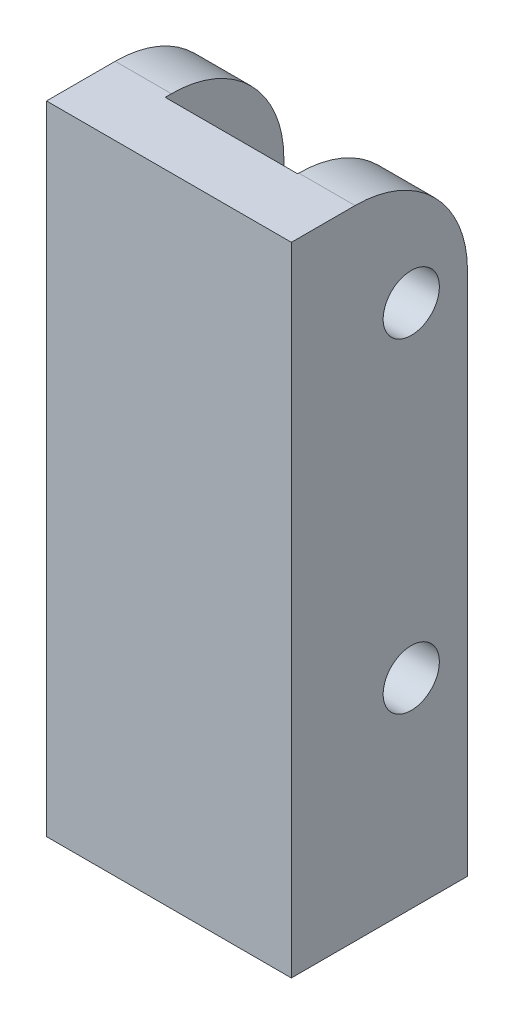
ISO-10303-21;
HEADER;
FILE_DESCRIPTION(('STEP AP214'),'2;1');
FILE_NAME('part.step','',(''),(''),'','','');
FILE_SCHEMA(('AUTOMOTIVE_DESIGN { 1 0 10303 214 1 1 1 1 }'));
ENDSEC;
DATA;
#1=APPLICATION_CONTEXT('core data for automotive mechanical design processes');
#2=APPLICATION_PROTOCOL_DEFINITION('international standard','automotive_design',2000,#1);
#3=PRODUCT_CONTEXT('',#1,'mechanical');
#4=PRODUCT('Part','Part','',(#3));
#5=PRODUCT_RELATED_PRODUCT_CATEGORY('part','',(#4));
#6=PRODUCT_DEFINITION_FORMATION('','',#4);
#7=PRODUCT_DEFINITION_CONTEXT('part definition',#1,'design');
#8=PRODUCT_DEFINITION('design','',#6,#7);
#9=PRODUCT_DEFINITION_SHAPE('','',#8);
#10=(LENGTH_UNIT() NAMED_UNIT(*) SI_UNIT(.MILLI.,.METRE.));
#11=(NAMED_UNIT(*) PLANE_ANGLE_UNIT() SI_UNIT($,.RADIAN.));
#12=(NAMED_UNIT(*) SI_UNIT($,.STERADIAN.) SOLID_ANGLE_UNIT());
#13=UNCERTAINTY_MEASURE_WITH_UNIT(LENGTH_MEASURE(1.E-05),#10,'distance_accuracy_value','');
#14=(GEOMETRIC_REPRESENTATION_CONTEXT(3) GLOBAL_UNCERTAINTY_ASSIGNED_CONTEXT((#13)) GLOBAL_UNIT_ASSIGNED_CONTEXT((#10,
#11,#12)) REPRESENTATION_CONTEXT('',''));
#15=CARTESIAN_POINT('',(0.,0.,0.));
#16=DIRECTION('',(0.,0.,1.));
#17=DIRECTION('',(1.,0.,0.));
#18=AXIS2_PLACEMENT_3D('',#15,#16,#17);
#19=CARTESIAN_POINT('',(0.,51.,0.));
#20=DIRECTION('',(-1.,0.,0.));
#21=DIRECTION('',(0.,0.,1.));
#22=AXIS2_PLACEMENT_3D('',#19,#20,#21);
#23=PLANE('',#22);
#24=CARTESIAN_POINT('',(0.,42.,-4.59779179810726));
#25=DIRECTION('',(-1.,0.,0.));
#26=DIRECTION('',(0.,0.,1.));
#27=AXIS2_PLACEMENT_3D('',#24,#25,#26);
#28=CIRCLE('',#27,2.25);
#29=CARTESIAN_POINT('',(0.,42.,-2.34779179810726));
#30=VERTEX_POINT('',#29);
#31=EDGE_CURVE('E150',#30,#30,#28,.T.);
#32=ORIENTED_EDGE('',*,*,#31,.T.);
#33=EDGE_LOOP('',(#32));
#34=FACE_BOUND('',#33,.T.);
#35=CARTESIAN_POINT('',(0.,16.,-4.59779179810726));
#36=DIRECTION('',(-1.,0.,0.));
#37=DIRECTION('',(0.,0.,1.));
#38=AXIS2_PLACEMENT_3D('',#35,#36,#37);
#39=CIRCLE('',#38,2.25);
#40=CARTESIAN_POINT('',(0.,16.,-2.34779179810726));
#41=VERTEX_POINT('',#40);
#42=EDGE_CURVE('E183',#41,#41,#39,.T.);
#43=ORIENTED_EDGE('',*,*,#42,.T.);
#44=EDGE_LOOP('',(#43));
#45=FACE_BOUND('',#44,.T.);
#46=DIRECTION('',(0.,-1.,0.));
#47=VECTOR('',#46,1.);
#48=CARTESIAN_POINT('',(0.,51.,-9.5));
#49=LINE('',#48,#47);
#50=CARTESIAN_POINT('',(0.,42.,-9.5));
#51=VERTEX_POINT('',#50);
#52=CARTESIAN_POINT('',(0.,0.,-9.5));
#53=VERTEX_POINT('',#52);
#54=EDGE_CURVE('E177',#51,#53,#49,.T.);
#55=ORIENTED_EDGE('',*,*,#54,.F.);
#56=CARTESIAN_POINT('',(0.,42.,-0.5));
#57=DIRECTION('',(-1.,0.,0.));
#58=DIRECTION('',(0.,0.,1.));
#59=AXIS2_PLACEMENT_3D('',#56,#57,#58);
#60=CIRCLE('',#59,9.);
#61=CARTESIAN_POINT('',(0.,51.,-0.5));
#62=VERTEX_POINT('',#61);
#63=EDGE_CURVE('E195',#51,#62,#60,.F.);
#64=ORIENTED_EDGE('',*,*,#63,.T.);
#65=DIRECTION('',(0.,0.,-1.));
#66=VECTOR('',#65,1.);
#67=CARTESIAN_POINT('',(0.,51.,0.));
#68=LINE('',#67,#66);
#69=CARTESIAN_POINT('',(0.,51.,0.));
#70=VERTEX_POINT('',#69);
#71=EDGE_CURVE('E121',#70,#62,#68,.T.);
#72=ORIENTED_EDGE('',*,*,#71,.F.);
#73=DIRECTION('',(0.,-1.,0.));
#74=VECTOR('',#73,1.);
#75=CARTESIAN_POINT('',(0.,51.,0.));
#76=LINE('',#75,#74);
#77=CARTESIAN_POINT('',(0.,0.,0.));
#78=VERTEX_POINT('',#77);
#79=EDGE_CURVE('E145',#70,#78,#76,.T.);
#80=ORIENTED_EDGE('',*,*,#79,.T.);
#81=DIRECTION('',(0.,0.,-1.));
#82=VECTOR('',#81,1.);
#83=CARTESIAN_POINT('',(0.,0.,0.));
#84=LINE('',#83,#82);
#85=EDGE_CURVE('E146',#78,#53,#84,.T.);
#86=ORIENTED_EDGE('',*,*,#85,.T.);
#87=EDGE_LOOP('',(#55,#64,#72,#80,#86));
#88=FACE_BOUND('',#87,.T.);
#89=ADVANCED_FACE('F35',(#34,#45,#88),#23,.F.);
#90=CARTESIAN_POINT('',(0.,51.,-9.5));
#91=DIRECTION('',(0.,0.,1.));
#92=DIRECTION('',(1.,0.,0.));
#93=AXIS2_PLACEMENT_3D('',#90,#91,#92);
#94=PLANE('',#93);
#95=DIRECTION('',(0.,-1.,0.));
#96=VECTOR('',#95,1.);
#97=CARTESIAN_POINT('',(-4.5,51.,-9.5));
#98=LINE('',#97,#96);
#99=CARTESIAN_POINT('',(-4.5,42.,-9.5));
#100=VERTEX_POINT('',#99);
#101=CARTESIAN_POINT('',(-4.5,0.,-9.5));
#102=VERTEX_POINT('',#101);
#103=EDGE_CURVE('E130',#100,#102,#98,.T.);
#104=ORIENTED_EDGE('',*,*,#103,.F.);
#105=DIRECTION('',(-1.,0.,0.));
#106=VECTOR('',#105,1.);
#107=CARTESIAN_POINT('',(0.,42.,-9.5));
#108=LINE('',#107,#106);
#109=EDGE_CURVE('E193',#100,#51,#108,.F.);
#110=ORIENTED_EDGE('',*,*,#109,.T.);
#111=ORIENTED_EDGE('',*,*,#54,.T.);
#112=DIRECTION('',(-1.,0.,0.));
#113=VECTOR('',#112,1.);
#114=CARTESIAN_POINT('',(0.,0.,-9.5));
#115=LINE('',#114,#113);
#116=EDGE_CURVE('E149',#53,#102,#115,.T.);
#117=ORIENTED_EDGE('',*,*,#116,.T.);
#118=EDGE_LOOP('',(#104,#110,#111,#117));
#119=FACE_BOUND('',#118,.T.);
#120=ADVANCED_FACE('F208',(#119),#94,.F.);
#121=CARTESIAN_POINT('',(-4.5,51.,-9.5));
#122=DIRECTION('',(1.,0.,0.));
#123=DIRECTION('',(0.,0.,-1.));
#124=AXIS2_PLACEMENT_3D('',#121,#122,#123);
#125=PLANE('',#124);
#126=CARTESIAN_POINT('',(-4.5,42.,-4.59779179810726));
#127=DIRECTION('',(1.,0.,0.));
#128=DIRECTION('',(0.,0.,-1.));
#129=AXIS2_PLACEMENT_3D('',#126,#127,#128);
#130=CIRCLE('',#129,2.25);
#131=CARTESIAN_POINT('',(-4.5,42.,-6.84779179810726));
#132=VERTEX_POINT('',#131);
#133=EDGE_CURVE('E184',#132,#132,#130,.T.);
#134=ORIENTED_EDGE('',*,*,#133,.T.);
#135=EDGE_LOOP('',(#134));
#136=FACE_BOUND('',#135,.T.);
#137=CARTESIAN_POINT('',(-4.5,16.,-4.59779179810726));
#138=DIRECTION('',(1.,0.,0.));
#139=DIRECTION('',(0.,0.,-1.));
#140=AXIS2_PLACEMENT_3D('',#137,#138,#139);
#141=CIRCLE('',#140,2.25);
#142=CARTESIAN_POINT('',(-4.5,16.,-6.84779179810726));
#143=VERTEX_POINT('',#142);
#144=EDGE_CURVE('E287',#143,#143,#141,.T.);
#145=ORIENTED_EDGE('',*,*,#144,.T.);
#146=EDGE_LOOP('',(#145));
#147=FACE_BOUND('',#146,.T.);
#148=DIRECTION('',(0.,0.,1.));
#149=VECTOR('',#148,1.);
#150=CARTESIAN_POINT('',(-4.5,51.,-9.5));
#151=LINE('',#150,#149);
#152=CARTESIAN_POINT('',(-4.5,51.,-0.5));
#153=VERTEX_POINT('',#152);
#154=CARTESIAN_POINT('',(-4.5,51.,5.));
#155=VERTEX_POINT('',#154);
#156=EDGE_CURVE('E110',#153,#155,#151,.T.);
#157=ORIENTED_EDGE('',*,*,#156,.F.);
#158=CARTESIAN_POINT('',(-4.5,42.,-0.5));
#159=DIRECTION('',(1.,0.,0.));
#160=DIRECTION('',(0.,0.,-1.));
#161=AXIS2_PLACEMENT_3D('',#158,#159,#160);
#162=CIRCLE('',#161,9.);
#163=EDGE_CURVE('E191',#153,#100,#162,.F.);
#164=ORIENTED_EDGE('',*,*,#163,.T.);
#165=ORIENTED_EDGE('',*,*,#103,.T.);
#166=DIRECTION('',(0.,0.,1.));
#167=VECTOR('',#166,1.);
#168=CARTESIAN_POINT('',(-4.5,0.,-9.5));
#169=LINE('',#168,#167);
#170=CARTESIAN_POINT('',(-4.5,0.,5.));
#171=VERTEX_POINT('',#170);
#172=EDGE_CURVE('E127',#102,#171,#169,.T.);
#173=ORIENTED_EDGE('',*,*,#172,.T.);
#174=DIRECTION('',(0.,-1.,0.));
#175=VECTOR('',#174,1.);
#176=CARTESIAN_POINT('',(-4.5,51.,5.));
#177=LINE('',#176,#175);
#178=EDGE_CURVE('E124',#155,#171,#177,.T.);
#179=ORIENTED_EDGE('',*,*,#178,.F.);
#180=EDGE_LOOP('',(#157,#164,#165,#173,#179));
#181=FACE_BOUND('',#180,.T.);
#182=ADVANCED_FACE('F125',(#136,#147,#181),#125,.F.);
#183=CARTESIAN_POINT('',(-4.5,51.,5.));
#184=DIRECTION('',(0.,0.,-1.));
#185=DIRECTION('',(-1.,0.,0.));
#186=AXIS2_PLACEMENT_3D('',#183,#184,#185);
#187=PLANE('',#186);
#188=DIRECTION('',(1.,0.,0.));
#189=VECTOR('',#188,1.);
#190=CARTESIAN_POINT('',(-4.5,0.,5.));
#191=LINE('',#190,#189);
#192=CARTESIAN_POINT('',(15.1,0.,5.));
#193=VERTEX_POINT('',#192);
#194=EDGE_CURVE('E154',#171,#193,#191,.T.);
#195=ORIENTED_EDGE('',*,*,#194,.T.);
#196=DIRECTION('',(0.,-1.,0.));
#197=VECTOR('',#196,1.);
#198=CARTESIAN_POINT('',(15.1,51.,5.));
#199=LINE('',#198,#197);
#200=CARTESIAN_POINT('',(15.1,51.,5.));
#201=VERTEX_POINT('',#200);
#202=EDGE_CURVE('E131',#201,#193,#199,.T.);
#203=ORIENTED_EDGE('',*,*,#202,.F.);
#204=DIRECTION('',(1.,0.,0.));
#205=VECTOR('',#204,1.);
#206=CARTESIAN_POINT('',(-4.5,51.,5.));
#207=LINE('',#206,#205);
#208=EDGE_CURVE('E116',#155,#201,#207,.T.);
#209=ORIENTED_EDGE('',*,*,#208,.F.);
#210=ORIENTED_EDGE('',*,*,#178,.T.);
#211=EDGE_LOOP('',(#195,#203,#209,#210));
#212=FACE_BOUND('',#211,.T.);
#213=ADVANCED_FACE('F133',(#212),#187,.F.);
#214=CARTESIAN_POINT('',(15.1,51.,5.));
#215=DIRECTION('',(-1.,0.,0.));
#216=DIRECTION('',(0.,0.,1.));
#217=AXIS2_PLACEMENT_3D('',#214,#215,#216);
#218=PLANE('',#217);
#219=CARTESIAN_POINT('',(15.1,42.,-4.59779179810726));
#220=DIRECTION('',(1.,0.,0.));
#221=DIRECTION('',(0.,0.,-1.));
#222=AXIS2_PLACEMENT_3D('',#219,#220,#221);
#223=CIRCLE('',#222,2.25);
#224=CARTESIAN_POINT('',(15.1,42.,-6.84779179810726));
#225=VERTEX_POINT('',#224);
#226=EDGE_CURVE('E279',#225,#225,#223,.T.);
#227=ORIENTED_EDGE('',*,*,#226,.F.);
#228=EDGE_LOOP('',(#227));
#229=FACE_BOUND('',#228,.T.);
#230=CARTESIAN_POINT('',(15.1,16.,-4.59779179810726));
#231=DIRECTION('',(1.,0.,0.));
#232=DIRECTION('',(0.,0.,-1.));
#233=AXIS2_PLACEMENT_3D('',#230,#231,#232);
#234=CIRCLE('',#233,2.25);
#235=CARTESIAN_POINT('',(15.1,16.,-6.84779179810726));
#236=VERTEX_POINT('',#235);
#237=EDGE_CURVE('E292',#236,#236,#234,.T.);
#238=ORIENTED_EDGE('',*,*,#237,.F.);
#239=EDGE_LOOP('',(#238));
#240=FACE_BOUND('',#239,.T.);
#241=DIRECTION('',(0.,-1.,0.));
#242=VECTOR('',#241,1.);
#243=CARTESIAN_POINT('',(15.1,51.,-9.09779179810726));
#244=LINE('',#243,#242);
#245=CARTESIAN_POINT('',(15.1,42.,-9.09779179810726));
#246=VERTEX_POINT('',#245);
#247=CARTESIAN_POINT('',(15.1,0.,-9.09779179810726));
#248=VERTEX_POINT('',#247);
#249=EDGE_CURVE('E173',#246,#248,#244,.T.);
#250=ORIENTED_EDGE('',*,*,#249,.F.);
#251=CARTESIAN_POINT('',(15.1,42.,-0.0977917981072572));
#252=DIRECTION('',(-1.,0.,0.));
#253=DIRECTION('',(0.,0.,1.));
#254=AXIS2_PLACEMENT_3D('',#251,#252,#253);
#255=CIRCLE('',#254,9.);
#256=CARTESIAN_POINT('',(15.1,51.,-0.0977917981072555));
#257=VERTEX_POINT('',#256);
#258=EDGE_CURVE('E11',#246,#257,#255,.F.);
#259=ORIENTED_EDGE('',*,*,#258,.T.);
#260=DIRECTION('',(0.,0.,-1.));
#261=VECTOR('',#260,1.);
#262=CARTESIAN_POINT('',(15.1,51.,5.));
#263=LINE('',#262,#261);
#264=EDGE_CURVE('E136',#201,#257,#263,.T.);
#265=ORIENTED_EDGE('',*,*,#264,.F.);
#266=ORIENTED_EDGE('',*,*,#202,.T.);
#267=DIRECTION('',(0.,0.,-1.));
#268=VECTOR('',#267,1.);
#269=CARTESIAN_POINT('',(15.1,0.,5.));
#270=LINE('',#269,#268);
#271=EDGE_CURVE('E156',#193,#248,#270,.T.);
#272=ORIENTED_EDGE('',*,*,#271,.T.);
#273=EDGE_LOOP('',(#250,#259,#265,#266,#272));
#274=FACE_BOUND('',#273,.T.);
#275=ADVANCED_FACE('F216',(#229,#240,#274),#218,.F.);
#276=CARTESIAN_POINT('',(15.1,51.,-9.09779179810726));
#277=DIRECTION('',(0.,0.,1.));
#278=DIRECTION('',(1.,0.,0.));
#279=AXIS2_PLACEMENT_3D('',#276,#277,#278);
#280=PLANE('',#279);
#281=DIRECTION('',(0.,-1.,0.));
#282=VECTOR('',#281,1.);
#283=CARTESIAN_POINT('',(10.6,51.,-9.09779179810726));
#284=LINE('',#283,#282);
#285=CARTESIAN_POINT('',(10.6,42.,-9.09779179810726));
#286=VERTEX_POINT('',#285);
#287=CARTESIAN_POINT('',(10.6,0.,-9.09779179810726));
#288=VERTEX_POINT('',#287);
#289=EDGE_CURVE('E171',#286,#288,#284,.T.);
#290=ORIENTED_EDGE('',*,*,#289,.F.);
#291=DIRECTION('',(-1.,0.,0.));
#292=VECTOR('',#291,1.);
#293=CARTESIAN_POINT('',(15.1,42.,-9.09779179810726));
#294=LINE('',#293,#292);
#295=EDGE_CURVE('E43',#286,#246,#294,.F.);
#296=ORIENTED_EDGE('',*,*,#295,.T.);
#297=ORIENTED_EDGE('',*,*,#249,.T.);
#298=DIRECTION('',(-1.,0.,0.));
#299=VECTOR('',#298,1.);
#300=CARTESIAN_POINT('',(15.1,0.,-9.09779179810726));
#301=LINE('',#300,#299);
#302=EDGE_CURVE('E159',#248,#288,#301,.T.);
#303=ORIENTED_EDGE('',*,*,#302,.T.);
#304=EDGE_LOOP('',(#290,#296,#297,#303));
#305=FACE_BOUND('',#304,.T.);
#306=ADVANCED_FACE('F242',(#305),#280,.F.);
#307=CARTESIAN_POINT('',(10.6,51.,0.));
#308=DIRECTION('',(1.,0.,0.));
#309=DIRECTION('',(0.,0.,-1.));
#310=AXIS2_PLACEMENT_3D('',#307,#308,#309);
#311=PLANE('',#310);
#312=CARTESIAN_POINT('',(10.6,42.,-4.59779179810726));
#313=DIRECTION('',(1.,0.,0.));
#314=DIRECTION('',(0.,0.,-1.));
#315=AXIS2_PLACEMENT_3D('',#312,#313,#314);
#316=CIRCLE('',#315,2.25);
#317=CARTESIAN_POINT('',(10.6,42.,-6.84779179810726));
#318=VERTEX_POINT('',#317);
#319=EDGE_CURVE('E185',#318,#318,#316,.T.);
#320=ORIENTED_EDGE('',*,*,#319,.T.);
#321=EDGE_LOOP('',(#320));
#322=FACE_BOUND('',#321,.T.);
#323=CARTESIAN_POINT('',(10.6,16.,-4.59779179810726));
#324=DIRECTION('',(1.,0.,0.));
#325=DIRECTION('',(0.,0.,-1.));
#326=AXIS2_PLACEMENT_3D('',#323,#324,#325);
#327=CIRCLE('',#326,2.25);
#328=CARTESIAN_POINT('',(10.6,16.,-6.84779179810726));
#329=VERTEX_POINT('',#328);
#330=EDGE_CURVE('E180',#329,#329,#327,.T.);
#331=ORIENTED_EDGE('',*,*,#330,.T.);
#332=EDGE_LOOP('',(#331));
#333=FACE_BOUND('',#332,.T.);
#334=DIRECTION('',(0.,0.,1.));
#335=VECTOR('',#334,1.);
#336=CARTESIAN_POINT('',(10.6,51.,0.));
#337=LINE('',#336,#335);
#338=CARTESIAN_POINT('',(10.6,51.,-0.0977917981072572));
#339=VERTEX_POINT('',#338);
#340=CARTESIAN_POINT('',(10.6,51.,0.));
#341=VERTEX_POINT('',#340);
#342=EDGE_CURVE('E138',#339,#341,#337,.T.);
#343=ORIENTED_EDGE('',*,*,#342,.F.);
#344=CARTESIAN_POINT('',(10.6,42.,-0.0977917981072572));
#345=DIRECTION('',(1.,0.,0.));
#346=DIRECTION('',(0.,0.,-1.));
#347=AXIS2_PLACEMENT_3D('',#344,#345,#346);
#348=CIRCLE('',#347,9.);
#349=EDGE_CURVE('E57',#339,#286,#348,.F.);
#350=ORIENTED_EDGE('',*,*,#349,.T.);
#351=ORIENTED_EDGE('',*,*,#289,.T.);
#352=DIRECTION('',(0.,0.,1.));
#353=VECTOR('',#352,1.);
#354=CARTESIAN_POINT('',(10.6,0.,0.));
#355=LINE('',#354,#353);
#356=CARTESIAN_POINT('',(10.6,0.,0.));
#357=VERTEX_POINT('',#356);
#358=EDGE_CURVE('E162',#288,#357,#355,.T.);
#359=ORIENTED_EDGE('',*,*,#358,.T.);
#360=DIRECTION('',(0.,-1.,0.));
#361=VECTOR('',#360,1.);
#362=CARTESIAN_POINT('',(10.6,51.,0.));
#363=LINE('',#362,#361);
#364=EDGE_CURVE('E168',#341,#357,#363,.T.);
#365=ORIENTED_EDGE('',*,*,#364,.F.);
#366=EDGE_LOOP('',(#343,#350,#351,#359,#365));
#367=FACE_BOUND('',#366,.T.);
#368=ADVANCED_FACE('F246',(#322,#333,#367),#311,.F.);
#369=CARTESIAN_POINT('',(0.,51.,0.));
#370=DIRECTION('',(0.,0.,1.));
#371=DIRECTION('',(1.,0.,0.));
#372=AXIS2_PLACEMENT_3D('',#369,#370,#371);
#373=PLANE('',#372);
#374=DIRECTION('',(-1.,0.,0.));
#375=VECTOR('',#374,1.);
#376=CARTESIAN_POINT('',(0.,0.,0.));
#377=LINE('',#376,#375);
#378=EDGE_CURVE('E164',#357,#78,#377,.T.);
#379=ORIENTED_EDGE('',*,*,#378,.T.);
#380=ORIENTED_EDGE('',*,*,#79,.F.);
#381=DIRECTION('',(-1.,0.,0.));
#382=VECTOR('',#381,1.);
#383=CARTESIAN_POINT('',(0.,51.,0.));
#384=LINE('',#383,#382);
#385=EDGE_CURVE('E143',#341,#70,#384,.T.);
#386=ORIENTED_EDGE('',*,*,#385,.F.);
#387=ORIENTED_EDGE('',*,*,#364,.T.);
#388=EDGE_LOOP('',(#379,#380,#386,#387));
#389=FACE_BOUND('',#388,.T.);
#390=ADVANCED_FACE('F249',(#389),#373,.F.);
#391=CARTESIAN_POINT('',(0.,51.,0.));
#392=DIRECTION('',(0.,1.,0.));
#393=DIRECTION('',(0.,0.,1.));
#394=AXIS2_PLACEMENT_3D('',#391,#392,#393);
#395=PLANE('',#394);
#396=ORIENTED_EDGE('',*,*,#71,.T.);
#397=DIRECTION('',(-1.,0.,0.));
#398=VECTOR('',#397,1.);
#399=CARTESIAN_POINT('',(-4.5,51.,-0.5));
#400=LINE('',#399,#398);
#401=EDGE_CURVE('E119',#62,#153,#400,.T.);
#402=ORIENTED_EDGE('',*,*,#401,.T.);
#403=ORIENTED_EDGE('',*,*,#156,.T.);
#404=ORIENTED_EDGE('',*,*,#208,.T.);
#405=ORIENTED_EDGE('',*,*,#264,.T.);
#406=DIRECTION('',(-1.,0.,0.));
#407=VECTOR('',#406,1.);
#408=CARTESIAN_POINT('',(10.6,51.,-0.0977917981072572));
#409=LINE('',#408,#407);
#410=EDGE_CURVE('E179',#257,#339,#409,.T.);
#411=ORIENTED_EDGE('',*,*,#410,.T.);
#412=ORIENTED_EDGE('',*,*,#342,.T.);
#413=ORIENTED_EDGE('',*,*,#385,.T.);
#414=EDGE_LOOP('',(#396,#402,#403,#404,#405,#411,#412,#413));
#415=FACE_BOUND('',#414,.T.);
#416=ADVANCED_FACE('F113',(#415),#395,.T.);
#417=CARTESIAN_POINT('',(0.,0.,0.));
#418=DIRECTION('',(0.,1.,0.));
#419=DIRECTION('',(0.,0.,1.));
#420=AXIS2_PLACEMENT_3D('',#417,#418,#419);
#421=PLANE('',#420);
#422=ORIENTED_EDGE('',*,*,#85,.F.);
#423=ORIENTED_EDGE('',*,*,#378,.F.);
#424=ORIENTED_EDGE('',*,*,#358,.F.);
#425=ORIENTED_EDGE('',*,*,#302,.F.);
#426=ORIENTED_EDGE('',*,*,#271,.F.);
#427=ORIENTED_EDGE('',*,*,#194,.F.);
#428=ORIENTED_EDGE('',*,*,#172,.F.);
#429=ORIENTED_EDGE('',*,*,#116,.F.);
#430=EDGE_LOOP('',(#422,#423,#424,#425,#426,#427,#428,#429));
#431=FACE_BOUND('',#430,.T.);
#432=ADVANCED_FACE('F212',(#431),#421,.F.);
#433=CARTESIAN_POINT('',(-4.5,16.,-4.59779179810726));
#434=DIRECTION('',(1.,0.,0.));
#435=DIRECTION('',(0.,0.,-1.));
#436=AXIS2_PLACEMENT_3D('',#433,#434,#435);
#437=CYLINDRICAL_SURFACE('',#436,2.25);
#438=ORIENTED_EDGE('',*,*,#237,.T.);
#439=EDGE_LOOP('',(#438));
#440=FACE_BOUND('',#439,.T.);
#441=ORIENTED_EDGE('',*,*,#330,.F.);
#442=EDGE_LOOP('',(#441));
#443=FACE_BOUND('',#442,.T.);
#444=ADVANCED_FACE('F256',(#440,#443),#437,.F.);
#445=CARTESIAN_POINT('',(-4.5,42.,-4.59779179810726));
#446=DIRECTION('',(1.,0.,0.));
#447=DIRECTION('',(0.,0.,-1.));
#448=AXIS2_PLACEMENT_3D('',#445,#446,#447);
#449=CYLINDRICAL_SURFACE('',#448,2.25);
#450=ORIENTED_EDGE('',*,*,#226,.T.);
#451=EDGE_LOOP('',(#450));
#452=FACE_BOUND('',#451,.T.);
#453=ORIENTED_EDGE('',*,*,#319,.F.);
#454=EDGE_LOOP('',(#453));
#455=FACE_BOUND('',#454,.T.);
#456=ADVANCED_FACE('F262',(#452,#455),#449,.F.);
#457=ORIENTED_EDGE('',*,*,#144,.F.);
#458=EDGE_LOOP('',(#457));
#459=FACE_BOUND('',#458,.T.);
#460=ORIENTED_EDGE('',*,*,#42,.F.);
#461=EDGE_LOOP('',(#460));
#462=FACE_BOUND('',#461,.T.);
#463=ADVANCED_FACE('F259',(#459,#462),#437,.F.);
#464=ORIENTED_EDGE('',*,*,#133,.F.);
#465=EDGE_LOOP('',(#464));
#466=FACE_BOUND('',#465,.T.);
#467=ORIENTED_EDGE('',*,*,#31,.F.);
#468=EDGE_LOOP('',(#467));
#469=FACE_BOUND('',#468,.T.);
#470=ADVANCED_FACE('F224',(#466,#469),#449,.F.);
#471=CARTESIAN_POINT('',(0.,42.,-0.5));
#472=DIRECTION('',(1.,0.,0.));
#473=DIRECTION('',(0.,0.,-1.));
#474=AXIS2_PLACEMENT_3D('',#471,#472,#473);
#475=CYLINDRICAL_SURFACE('',#474,9.);
#476=ORIENTED_EDGE('',*,*,#63,.F.);
#477=ORIENTED_EDGE('',*,*,#109,.F.);
#478=ORIENTED_EDGE('',*,*,#163,.F.);
#479=ORIENTED_EDGE('',*,*,#401,.F.);
#480=EDGE_LOOP('',(#476,#477,#478,#479));
#481=FACE_BOUND('',#480,.T.);
#482=ADVANCED_FACE('F205',(#481),#475,.T.);
#483=CARTESIAN_POINT('',(0.,42.,-0.0977917981072572));
#484=DIRECTION('',(1.,0.,0.));
#485=DIRECTION('',(0.,0.,-1.));
#486=AXIS2_PLACEMENT_3D('',#483,#484,#485);
#487=CYLINDRICAL_SURFACE('',#486,9.);
#488=ORIENTED_EDGE('',*,*,#258,.F.);
#489=ORIENTED_EDGE('',*,*,#295,.F.);
#490=ORIENTED_EDGE('',*,*,#349,.F.);
#491=ORIENTED_EDGE('',*,*,#410,.F.);
#492=EDGE_LOOP('',(#488,#489,#490,#491));
#493=FACE_BOUND('',#492,.T.);
#494=ADVANCED_FACE('F37',(#493),#487,.T.);
#495=CLOSED_SHELL('',(#89,#120,#182,#213,#275,#306,#368,#390,#416,#432,#444,#456,#463,#470,#482,#494));
#496=MANIFOLD_SOLID_BREP('B2',#495);
#497=ADVANCED_BREP_SHAPE_REPRESENTATION('',(#18,#496),#14);
#498=SHAPE_DEFINITION_REPRESENTATION(#9,#497);
ENDSEC;
END-ISO-10303-21;
